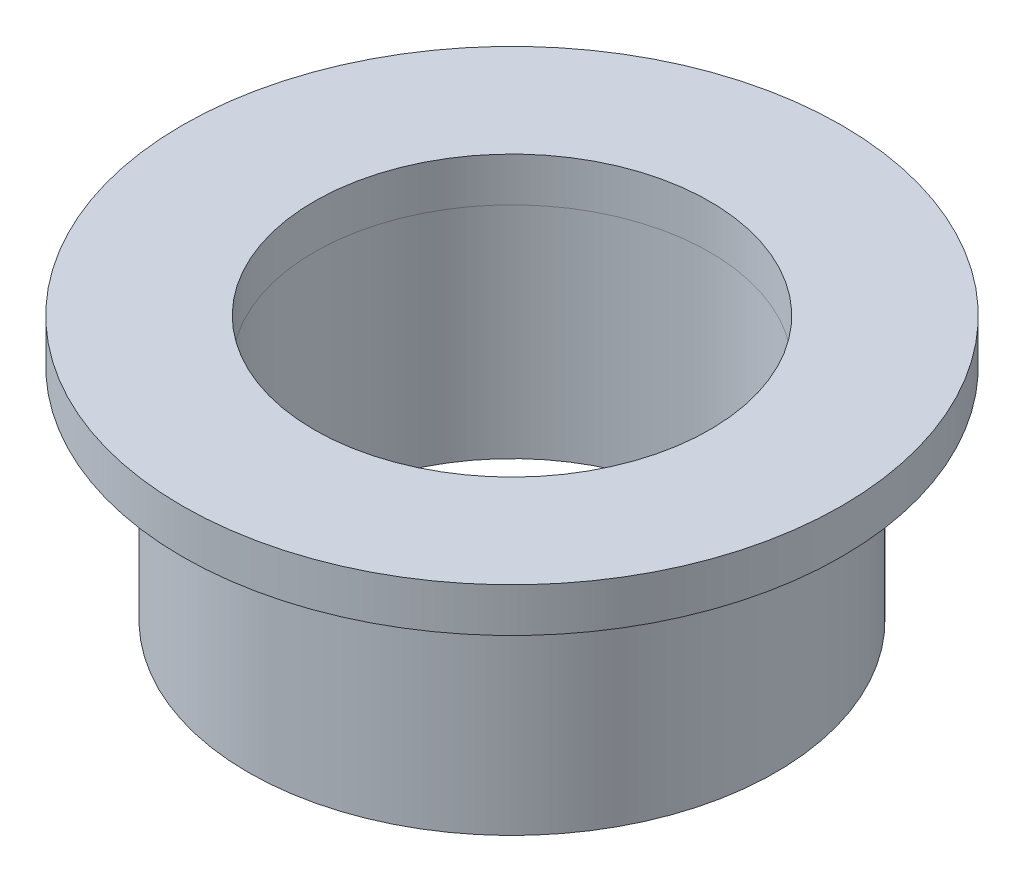
ISO-10303-21;
HEADER;
FILE_DESCRIPTION(('STEP AP214'),'2;1');
FILE_NAME('part.step','',(''),(''),'','','');
FILE_SCHEMA(('AUTOMOTIVE_DESIGN { 1 0 10303 214 1 1 1 1 }'));
ENDSEC;
DATA;
#1=APPLICATION_CONTEXT('core data for automotive mechanical design processes');
#2=APPLICATION_PROTOCOL_DEFINITION('international standard','automotive_design',2000,#1);
#3=PRODUCT_CONTEXT('',#1,'mechanical');
#4=PRODUCT('Part','Part','',(#3));
#5=PRODUCT_RELATED_PRODUCT_CATEGORY('part','',(#4));
#6=PRODUCT_DEFINITION_FORMATION('','',#4);
#7=PRODUCT_DEFINITION_CONTEXT('part definition',#1,'design');
#8=PRODUCT_DEFINITION('design','',#6,#7);
#9=PRODUCT_DEFINITION_SHAPE('','',#8);
#10=(LENGTH_UNIT() NAMED_UNIT(*) SI_UNIT(.MILLI.,.METRE.));
#11=(NAMED_UNIT(*) PLANE_ANGLE_UNIT() SI_UNIT($,.RADIAN.));
#12=(NAMED_UNIT(*) SI_UNIT($,.STERADIAN.) SOLID_ANGLE_UNIT());
#13=UNCERTAINTY_MEASURE_WITH_UNIT(LENGTH_MEASURE(1.E-05),#10,'distance_accuracy_value','');
#14=(GEOMETRIC_REPRESENTATION_CONTEXT(3) GLOBAL_UNCERTAINTY_ASSIGNED_CONTEXT((#13)) GLOBAL_UNIT_ASSIGNED_CONTEXT((#10,
#11,#12)) REPRESENTATION_CONTEXT('',''));
#15=CARTESIAN_POINT('',(0.,0.,0.));
#16=DIRECTION('',(0.,0.,1.));
#17=DIRECTION('',(1.,0.,0.));
#18=AXIS2_PLACEMENT_3D('',#15,#16,#17);
#19=CARTESIAN_POINT('',(0.,-5.,0.));
#20=DIRECTION('',(0.,1.,0.));
#21=DIRECTION('',(0.,0.,1.));
#22=AXIS2_PLACEMENT_3D('',#19,#20,#21);
#23=CYLINDRICAL_SURFACE('',#22,6.);
#24=CARTESIAN_POINT('',(0.,-5.,0.));
#25=DIRECTION('',(0.,1.,0.));
#26=DIRECTION('',(0.,0.,1.));
#27=AXIS2_PLACEMENT_3D('',#24,#25,#26);
#28=CIRCLE('',#27,6.);
#29=CARTESIAN_POINT('',(0.,-5.,6.));
#30=VERTEX_POINT('',#29);
#31=EDGE_CURVE('E12',#30,#30,#28,.T.);
#32=ORIENTED_EDGE('',*,*,#31,.T.);
#33=EDGE_LOOP('',(#32));
#34=FACE_BOUND('',#33,.T.);
#35=CARTESIAN_POINT('',(0.,0.,0.));
#36=DIRECTION('',(0.,1.,0.));
#37=DIRECTION('',(0.,0.,1.));
#38=AXIS2_PLACEMENT_3D('',#35,#36,#37);
#39=CIRCLE('',#38,6.);
#40=CARTESIAN_POINT('',(0.,0.,6.));
#41=VERTEX_POINT('',#40);
#42=EDGE_CURVE('E60',#41,#41,#39,.T.);
#43=ORIENTED_EDGE('',*,*,#42,.F.);
#44=EDGE_LOOP('',(#43));
#45=FACE_BOUND('',#44,.T.);
#46=ADVANCED_FACE('F57',(#34,#45),#23,.T.);
#47=CARTESIAN_POINT('',(0.,-5.,0.));
#48=DIRECTION('',(0.,1.,0.));
#49=DIRECTION('',(0.,0.,1.));
#50=AXIS2_PLACEMENT_3D('',#47,#48,#49);
#51=PLANE('',#50);
#52=CARTESIAN_POINT('',(0.,-5.,0.));
#53=DIRECTION('',(0.,1.,0.));
#54=DIRECTION('',(0.,0.,1.));
#55=AXIS2_PLACEMENT_3D('',#52,#53,#54);
#56=CIRCLE('',#55,4.5);
#57=CARTESIAN_POINT('',(0.,-5.,4.5));
#58=VERTEX_POINT('',#57);
#59=EDGE_CURVE('E69',#58,#58,#56,.T.);
#60=ORIENTED_EDGE('',*,*,#59,.T.);
#61=EDGE_LOOP('',(#60));
#62=FACE_BOUND('',#61,.T.);
#63=ORIENTED_EDGE('',*,*,#31,.F.);
#64=EDGE_LOOP('',(#63));
#65=FACE_BOUND('',#64,.T.);
#66=ADVANCED_FACE('F79',(#62,#65),#51,.F.);
#67=CARTESIAN_POINT('',(0.,0.,0.));
#68=DIRECTION('',(0.,1.,0.));
#69=DIRECTION('',(0.,0.,1.));
#70=AXIS2_PLACEMENT_3D('',#67,#68,#69);
#71=PLANE('',#70);
#72=CARTESIAN_POINT('',(0.,0.,0.));
#73=DIRECTION('',(0.,1.,0.));
#74=DIRECTION('',(0.,0.,1.));
#75=AXIS2_PLACEMENT_3D('',#72,#73,#74);
#76=CIRCLE('',#75,4.5);
#77=CARTESIAN_POINT('',(0.,0.,4.5));
#78=VERTEX_POINT('',#77);
#79=EDGE_CURVE('E71',#78,#78,#76,.T.);
#80=ORIENTED_EDGE('',*,*,#79,.F.);
#81=EDGE_LOOP('',(#80));
#82=FACE_BOUND('',#81,.T.);
#83=ORIENTED_EDGE('',*,*,#42,.T.);
#84=EDGE_LOOP('',(#83));
#85=FACE_BOUND('',#84,.T.);
#86=ADVANCED_FACE('F85',(#82,#85),#71,.T.);
#87=CARTESIAN_POINT('',(0.,-5.,0.));
#88=DIRECTION('',(0.,1.,0.));
#89=DIRECTION('',(0.,0.,1.));
#90=AXIS2_PLACEMENT_3D('',#87,#88,#89);
#91=CYLINDRICAL_SURFACE('',#90,4.5);
#92=ORIENTED_EDGE('',*,*,#59,.F.);
#93=EDGE_LOOP('',(#92));
#94=FACE_BOUND('',#93,.T.);
#95=ORIENTED_EDGE('',*,*,#79,.T.);
#96=EDGE_LOOP('',(#95));
#97=FACE_BOUND('',#96,.T.);
#98=ADVANCED_FACE('F82',(#94,#97),#91,.F.);
#99=CLOSED_SHELL('',(#46,#66,#86,#98));
#100=MANIFOLD_SOLID_BREP('B2',#99);
#101=CARTESIAN_POINT('',(0.,1.,0.));
#102=DIRECTION('',(0.,-1.,0.));
#103=DIRECTION('',(0.,0.,-1.));
#104=AXIS2_PLACEMENT_3D('',#101,#102,#103);
#105=CYLINDRICAL_SURFACE('',#104,4.5);
#106=CARTESIAN_POINT('',(0.,1.,0.));
#107=DIRECTION('',(0.,1.,0.));
#108=DIRECTION('',(0.,0.,1.));
#109=AXIS2_PLACEMENT_3D('',#106,#107,#108);
#110=CIRCLE('',#109,4.5);
#111=CARTESIAN_POINT('',(0.,1.,4.5));
#112=VERTEX_POINT('',#111);
#113=EDGE_CURVE('E138',#112,#112,#110,.T.);
#114=ORIENTED_EDGE('',*,*,#113,.T.);
#115=EDGE_LOOP('',(#114));
#116=FACE_BOUND('',#115,.T.);
#117=CARTESIAN_POINT('',(0.,0.,0.));
#118=DIRECTION('',(0.,1.,0.));
#119=DIRECTION('',(0.,0.,1.));
#120=AXIS2_PLACEMENT_3D('',#117,#118,#119);
#121=CIRCLE('',#120,4.5);
#122=CARTESIAN_POINT('',(0.,0.,4.5));
#123=VERTEX_POINT('',#122);
#124=EDGE_CURVE('E144',#123,#123,#121,.T.);
#125=ORIENTED_EDGE('',*,*,#124,.F.);
#126=EDGE_LOOP('',(#125));
#127=FACE_BOUND('',#126,.T.);
#128=ADVANCED_FACE('F131',(#116,#127),#105,.F.);
#129=CARTESIAN_POINT('',(0.,1.,0.));
#130=DIRECTION('',(0.,-1.,0.));
#131=DIRECTION('',(0.,0.,-1.));
#132=AXIS2_PLACEMENT_3D('',#129,#130,#131);
#133=CYLINDRICAL_SURFACE('',#132,7.5);
#134=CARTESIAN_POINT('',(0.,1.,0.));
#135=DIRECTION('',(0.,1.,0.));
#136=DIRECTION('',(0.,0.,1.));
#137=AXIS2_PLACEMENT_3D('',#134,#135,#136);
#138=CIRCLE('',#137,7.5);
#139=CARTESIAN_POINT('',(0.,1.,7.5));
#140=VERTEX_POINT('',#139);
#141=EDGE_CURVE('E56',#140,#140,#138,.T.);
#142=ORIENTED_EDGE('',*,*,#141,.F.);
#143=EDGE_LOOP('',(#142));
#144=FACE_BOUND('',#143,.T.);
#145=CARTESIAN_POINT('',(0.,0.,0.));
#146=DIRECTION('',(0.,1.,0.));
#147=DIRECTION('',(0.,0.,1.));
#148=AXIS2_PLACEMENT_3D('',#145,#146,#147);
#149=CIRCLE('',#148,7.5);
#150=CARTESIAN_POINT('',(0.,0.,7.5));
#151=VERTEX_POINT('',#150);
#152=EDGE_CURVE('E134',#151,#151,#149,.T.);
#153=ORIENTED_EDGE('',*,*,#152,.T.);
#154=EDGE_LOOP('',(#153));
#155=FACE_BOUND('',#154,.T.);
#156=ADVANCED_FACE('F151',(#144,#155),#133,.T.);
#157=CARTESIAN_POINT('',(0.,1.,0.));
#158=DIRECTION('',(0.,1.,0.));
#159=DIRECTION('',(0.,0.,1.));
#160=AXIS2_PLACEMENT_3D('',#157,#158,#159);
#161=PLANE('',#160);
#162=ORIENTED_EDGE('',*,*,#113,.F.);
#163=EDGE_LOOP('',(#162));
#164=FACE_BOUND('',#163,.T.);
#165=ORIENTED_EDGE('',*,*,#141,.T.);
#166=EDGE_LOOP('',(#165));
#167=FACE_BOUND('',#166,.T.);
#168=ADVANCED_FACE('F155',(#164,#167),#161,.T.);
#169=CARTESIAN_POINT('',(0.,0.,0.));
#170=DIRECTION('',(0.,1.,0.));
#171=DIRECTION('',(0.,0.,1.));
#172=AXIS2_PLACEMENT_3D('',#169,#170,#171);
#173=PLANE('',#172);
#174=ORIENTED_EDGE('',*,*,#124,.T.);
#175=EDGE_LOOP('',(#174));
#176=FACE_BOUND('',#175,.T.);
#177=ORIENTED_EDGE('',*,*,#152,.F.);
#178=EDGE_LOOP('',(#177));
#179=FACE_BOUND('',#178,.T.);
#180=ADVANCED_FACE('F153',(#176,#179),#173,.F.);
#181=CLOSED_SHELL('',(#128,#156,#168,#180));
#182=MANIFOLD_SOLID_BREP('B7',#181);
#183=ADVANCED_BREP_SHAPE_REPRESENTATION('',(#18,#100,#182),#14);
#184=SHAPE_DEFINITION_REPRESENTATION(#9,#183);
ENDSEC;
END-ISO-10303-21;
